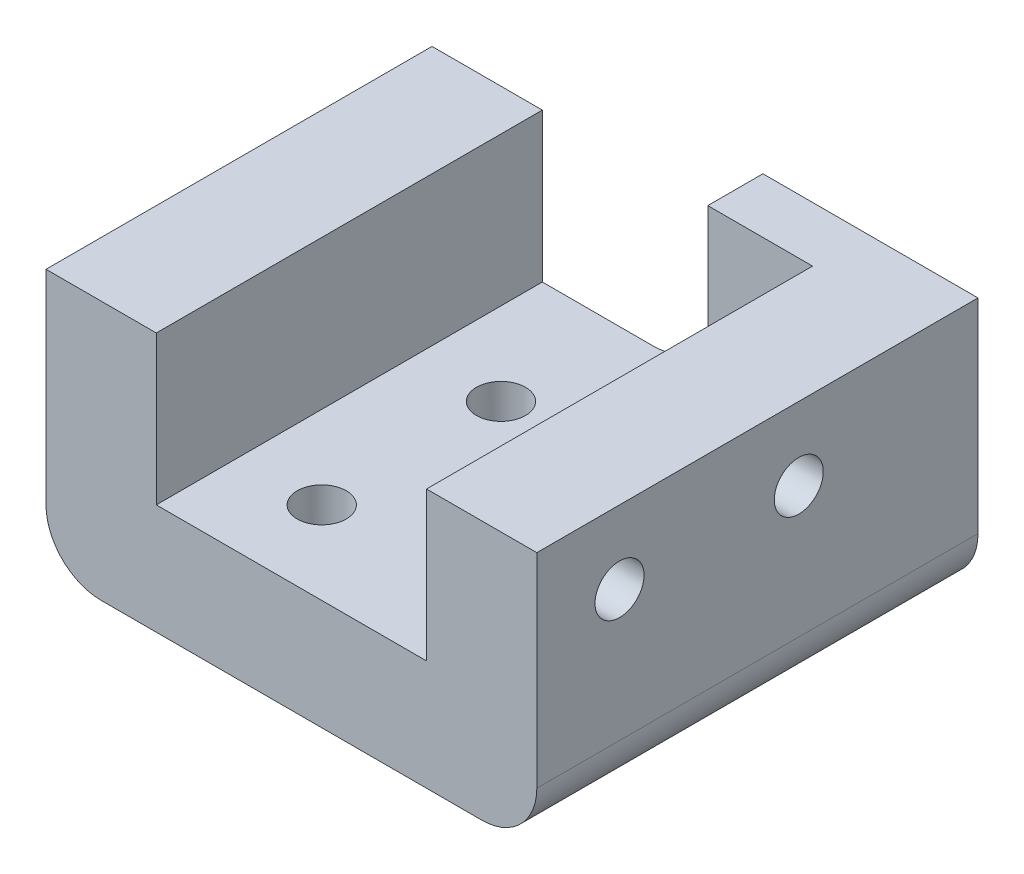
ISO-10303-21;
HEADER;
FILE_DESCRIPTION(('STEP AP214'),'2;1');
FILE_NAME('part.step','',(''),(''),'','','');
FILE_SCHEMA(('AUTOMOTIVE_DESIGN { 1 0 10303 214 1 1 1 1 }'));
ENDSEC;
DATA;
#1=APPLICATION_CONTEXT('core data for automotive mechanical design processes');
#2=APPLICATION_PROTOCOL_DEFINITION('international standard','automotive_design',2000,#1);
#3=PRODUCT_CONTEXT('',#1,'mechanical');
#4=PRODUCT('Part','Part','',(#3));
#5=PRODUCT_RELATED_PRODUCT_CATEGORY('part','',(#4));
#6=PRODUCT_DEFINITION_FORMATION('','',#4);
#7=PRODUCT_DEFINITION_CONTEXT('part definition',#1,'design');
#8=PRODUCT_DEFINITION('design','',#6,#7);
#9=PRODUCT_DEFINITION_SHAPE('','',#8);
#10=(LENGTH_UNIT() NAMED_UNIT(*) SI_UNIT(.MILLI.,.METRE.));
#11=(NAMED_UNIT(*) PLANE_ANGLE_UNIT() SI_UNIT($,.RADIAN.));
#12=(NAMED_UNIT(*) SI_UNIT($,.STERADIAN.) SOLID_ANGLE_UNIT());
#13=UNCERTAINTY_MEASURE_WITH_UNIT(LENGTH_MEASURE(1.E-05),#10,'distance_accuracy_value','');
#14=(GEOMETRIC_REPRESENTATION_CONTEXT(3) GLOBAL_UNCERTAINTY_ASSIGNED_CONTEXT((#13)) GLOBAL_UNIT_ASSIGNED_CONTEXT((#10,
#11,#12)) REPRESENTATION_CONTEXT('',''));
#15=CARTESIAN_POINT('',(0.,0.,0.));
#16=DIRECTION('',(0.,0.,1.));
#17=DIRECTION('',(1.,0.,0.));
#18=AXIS2_PLACEMENT_3D('',#15,#16,#17);
#19=CARTESIAN_POINT('',(2.075,2.,-3.5));
#20=DIRECTION('',(0.,0.,1.));
#21=DIRECTION('',(1.,0.,0.));
#22=AXIS2_PLACEMENT_3D('',#19,#20,#21);
#23=PLANE('',#22);
#24=DIRECTION('',(-1.,0.,0.));
#25=VECTOR('',#24,1.);
#26=CARTESIAN_POINT('',(2.075,0.,-3.5));
#27=LINE('',#26,#25);
#28=CARTESIAN_POINT('',(-0.0750000000000004,0.,-3.5));
#29=VERTEX_POINT('',#28);
#30=CARTESIAN_POINT('',(-3.075,0.,-3.5));
#31=VERTEX_POINT('',#30);
#32=EDGE_CURVE('E154',#29,#31,#27,.T.);
#33=ORIENTED_EDGE('',*,*,#32,.T.);
#34=CARTESIAN_POINT('',(-3.075,1.,-3.5));
#35=DIRECTION('',(0.,0.,1.));
#36=DIRECTION('',(1.,0.,0.));
#37=AXIS2_PLACEMENT_3D('',#34,#35,#36);
#38=CIRCLE('',#37,1.);
#39=CARTESIAN_POINT('',(-4.075,1.,-3.5));
#40=VERTEX_POINT('',#39);
#41=EDGE_CURVE('E11',#31,#40,#38,.F.);
#42=ORIENTED_EDGE('',*,*,#41,.T.);
#43=DIRECTION('',(0.,-1.,0.));
#44=VECTOR('',#43,1.);
#45=CARTESIAN_POINT('',(-4.075,2.,-3.5));
#46=LINE('',#45,#44);
#47=CARTESIAN_POINT('',(-4.075,4.7,-3.5));
#48=VERTEX_POINT('',#47);
#49=EDGE_CURVE('E241',#48,#40,#46,.T.);
#50=ORIENTED_EDGE('',*,*,#49,.F.);
#51=DIRECTION('',(-1.,0.,0.));
#52=VECTOR('',#51,1.);
#53=CARTESIAN_POINT('',(-4.075,4.7,-3.5));
#54=LINE('',#53,#52);
#55=CARTESIAN_POINT('',(-2.075,4.7,-3.5));
#56=VERTEX_POINT('',#55);
#57=EDGE_CURVE('E214',#56,#48,#54,.T.);
#58=ORIENTED_EDGE('',*,*,#57,.F.);
#59=DIRECTION('',(0.,-1.,0.));
#60=VECTOR('',#59,1.);
#61=CARTESIAN_POINT('',(-2.075,4.7,-3.5));
#62=LINE('',#61,#60);
#63=CARTESIAN_POINT('',(-2.075,2.,-3.5));
#64=VERTEX_POINT('',#63);
#65=EDGE_CURVE('E217',#56,#64,#62,.T.);
#66=ORIENTED_EDGE('',*,*,#65,.T.);
#67=DIRECTION('',(-1.,0.,0.));
#68=VECTOR('',#67,1.);
#69=CARTESIAN_POINT('',(-2.075,2.,-3.5));
#70=LINE('',#69,#68);
#71=CARTESIAN_POINT('',(-0.0750000000000013,2.,-3.5));
#72=VERTEX_POINT('',#71);
#73=EDGE_CURVE('E230',#72,#64,#70,.T.);
#74=ORIENTED_EDGE('',*,*,#73,.F.);
#75=DIRECTION('',(0.,1.,0.));
#76=VECTOR('',#75,1.);
#77=CARTESIAN_POINT('',(-0.0750000000000014,0.,-3.5));
#78=LINE('',#77,#76);
#79=EDGE_CURVE('E245',#72,#29,#78,.F.);
#80=ORIENTED_EDGE('',*,*,#79,.T.);
#81=EDGE_LOOP('',(#33,#42,#50,#58,#66,#74,#80));
#82=FACE_BOUND('',#81,.T.);
#83=ADVANCED_FACE('F40',(#82),#23,.F.);
#84=CARTESIAN_POINT('',(0.,2.,0.));
#85=DIRECTION('',(0.,1.,0.));
#86=DIRECTION('',(0.,0.,1.));
#87=AXIS2_PLACEMENT_3D('',#84,#85,#86);
#88=PLANE('',#87);
#89=CARTESIAN_POINT('',(-0.575,2.,2.));
#90=DIRECTION('',(0.,1.,0.));
#91=DIRECTION('',(0.,0.,1.));
#92=AXIS2_PLACEMENT_3D('',#89,#90,#91);
#93=CIRCLE('',#92,0.4445);
#94=CARTESIAN_POINT('',(-0.575,2.,2.4445));
#95=VERTEX_POINT('',#94);
#96=EDGE_CURVE('E172',#95,#95,#93,.T.);
#97=ORIENTED_EDGE('',*,*,#96,.F.);
#98=EDGE_LOOP('',(#97));
#99=FACE_BOUND('',#98,.T.);
#100=CARTESIAN_POINT('',(-0.575,2.,-1.25));
#101=DIRECTION('',(0.,1.,0.));
#102=DIRECTION('',(0.,0.,1.));
#103=AXIS2_PLACEMENT_3D('',#100,#101,#102);
#104=CIRCLE('',#103,0.4445);
#105=CARTESIAN_POINT('',(-0.575,2.,-0.8055));
#106=VERTEX_POINT('',#105);
#107=EDGE_CURVE('E300',#106,#106,#104,.T.);
#108=ORIENTED_EDGE('',*,*,#107,.F.);
#109=EDGE_LOOP('',(#108));
#110=FACE_BOUND('',#109,.T.);
#111=DIRECTION('',(1.,0.,0.));
#112=VECTOR('',#111,1.);
#113=CARTESIAN_POINT('',(-4.075,2.,3.5));
#114=LINE('',#113,#112);
#115=CARTESIAN_POINT('',(-2.075,2.,3.5));
#116=VERTEX_POINT('',#115);
#117=CARTESIAN_POINT('',(2.825,2.,3.5));
#118=VERTEX_POINT('',#117);
#119=EDGE_CURVE('E229',#116,#118,#114,.T.);
#120=ORIENTED_EDGE('',*,*,#119,.T.);
#121=DIRECTION('',(0.,0.,1.));
#122=VECTOR('',#121,1.);
#123=CARTESIAN_POINT('',(2.825,2.,-3.5));
#124=LINE('',#123,#122);
#125=CARTESIAN_POINT('',(2.825,2.,-3.5));
#126=VERTEX_POINT('',#125);
#127=EDGE_CURVE('E196',#126,#118,#124,.T.);
#128=ORIENTED_EDGE('',*,*,#127,.F.);
#129=CARTESIAN_POINT('',(0.924999999999999,2.,-3.5));
#130=VERTEX_POINT('',#129);
#131=EDGE_CURVE('E226',#126,#130,#70,.T.);
#132=ORIENTED_EDGE('',*,*,#131,.T.);
#133=DIRECTION('',(0.,0.,1.));
#134=VECTOR('',#133,1.);
#135=CARTESIAN_POINT('',(0.924999999999999,2.,-4.5));
#136=LINE('',#135,#134);
#137=CARTESIAN_POINT('',(0.924999999999999,2.,-4.5));
#138=VERTEX_POINT('',#137);
#139=EDGE_CURVE('E243',#138,#130,#136,.T.);
#140=ORIENTED_EDGE('',*,*,#139,.F.);
#141=CARTESIAN_POINT('',(-0.0750000000000012,2.,-4.5));
#142=DIRECTION('',(0.,1.,0.));
#143=DIRECTION('',(0.,0.,1.));
#144=AXIS2_PLACEMENT_3D('',#141,#142,#143);
#145=CIRCLE('',#144,1.);
#146=EDGE_CURVE('E158',#138,#72,#145,.F.);
#147=ORIENTED_EDGE('',*,*,#146,.T.);
#148=ORIENTED_EDGE('',*,*,#73,.T.);
#149=DIRECTION('',(0.,0.,-1.));
#150=VECTOR('',#149,1.);
#151=CARTESIAN_POINT('',(-2.075,2.,-3.5));
#152=LINE('',#151,#150);
#153=EDGE_CURVE('E199',#116,#64,#152,.T.);
#154=ORIENTED_EDGE('',*,*,#153,.F.);
#155=EDGE_LOOP('',(#120,#128,#132,#140,#147,#148,#154));
#156=FACE_BOUND('',#155,.T.);
#157=ADVANCED_FACE('F275',(#99,#110,#156),#88,.T.);
#158=CARTESIAN_POINT('',(-4.075,2.,-3.5));
#159=DIRECTION('',(1.,0.,0.));
#160=DIRECTION('',(0.,0.,-1.));
#161=AXIS2_PLACEMENT_3D('',#158,#159,#160);
#162=PLANE('',#161);
#163=ORIENTED_EDGE('',*,*,#49,.T.);
#164=DIRECTION('',(0.,0.,1.));
#165=VECTOR('',#164,1.);
#166=CARTESIAN_POINT('',(-4.075,1.,-3.5));
#167=LINE('',#166,#165);
#168=CARTESIAN_POINT('',(-4.075,1.,3.5));
#169=VERTEX_POINT('',#168);
#170=EDGE_CURVE('E48',#40,#169,#167,.T.);
#171=ORIENTED_EDGE('',*,*,#170,.T.);
#172=DIRECTION('',(0.,-1.,0.));
#173=VECTOR('',#172,1.);
#174=CARTESIAN_POINT('',(-4.075,2.,3.5));
#175=LINE('',#174,#173);
#176=CARTESIAN_POINT('',(-4.075,4.7,3.5));
#177=VERTEX_POINT('',#176);
#178=EDGE_CURVE('E238',#177,#169,#175,.T.);
#179=ORIENTED_EDGE('',*,*,#178,.F.);
#180=DIRECTION('',(0.,0.,1.));
#181=VECTOR('',#180,1.);
#182=CARTESIAN_POINT('',(-4.075,4.7,-3.5));
#183=LINE('',#182,#181);
#184=EDGE_CURVE('E207',#48,#177,#183,.T.);
#185=ORIENTED_EDGE('',*,*,#184,.F.);
#186=EDGE_LOOP('',(#163,#171,#179,#185));
#187=FACE_BOUND('',#186,.T.);
#188=ADVANCED_FACE('F258',(#187),#162,.F.);
#189=CARTESIAN_POINT('',(4.825,2.,3.5));
#190=DIRECTION('',(0.,0.,-1.));
#191=DIRECTION('',(-1.,0.,0.));
#192=AXIS2_PLACEMENT_3D('',#189,#190,#191);
#193=PLANE('',#192);
#194=DIRECTION('',(1.,0.,0.));
#195=VECTOR('',#194,1.);
#196=CARTESIAN_POINT('',(4.825,0.,3.5));
#197=LINE('',#196,#195);
#198=CARTESIAN_POINT('',(-3.075,0.,3.5));
#199=VERTEX_POINT('',#198);
#200=CARTESIAN_POINT('',(3.825,0.,3.5));
#201=VERTEX_POINT('',#200);
#202=EDGE_CURVE('E225',#199,#201,#197,.T.);
#203=ORIENTED_EDGE('',*,*,#202,.T.);
#204=CARTESIAN_POINT('',(3.825,1.,3.5));
#205=DIRECTION('',(0.,0.,-1.));
#206=DIRECTION('',(-1.,0.,0.));
#207=AXIS2_PLACEMENT_3D('',#204,#205,#206);
#208=CIRCLE('',#207,1.);
#209=CARTESIAN_POINT('',(4.825,1.,3.5));
#210=VERTEX_POINT('',#209);
#211=EDGE_CURVE('E256',#201,#210,#208,.F.);
#212=ORIENTED_EDGE('',*,*,#211,.T.);
#213=DIRECTION('',(0.,-1.,0.));
#214=VECTOR('',#213,1.);
#215=CARTESIAN_POINT('',(4.825,2.,3.5));
#216=LINE('',#215,#214);
#217=CARTESIAN_POINT('',(4.825,4.7,3.5));
#218=VERTEX_POINT('',#217);
#219=EDGE_CURVE('E232',#218,#210,#216,.T.);
#220=ORIENTED_EDGE('',*,*,#219,.F.);
#221=DIRECTION('',(1.,0.,0.));
#222=VECTOR('',#221,1.);
#223=CARTESIAN_POINT('',(2.825,4.7,3.5));
#224=LINE('',#223,#222);
#225=CARTESIAN_POINT('',(2.825,4.7,3.5));
#226=VERTEX_POINT('',#225);
#227=EDGE_CURVE('E202',#226,#218,#224,.T.);
#228=ORIENTED_EDGE('',*,*,#227,.F.);
#229=DIRECTION('',(0.,-1.,0.));
#230=VECTOR('',#229,1.);
#231=CARTESIAN_POINT('',(2.825,4.7,3.5));
#232=LINE('',#231,#230);
#233=EDGE_CURVE('E181',#226,#118,#232,.T.);
#234=ORIENTED_EDGE('',*,*,#233,.T.);
#235=ORIENTED_EDGE('',*,*,#119,.F.);
#236=DIRECTION('',(0.,-1.,0.));
#237=VECTOR('',#236,1.);
#238=CARTESIAN_POINT('',(-2.075,4.7,3.5));
#239=LINE('',#238,#237);
#240=CARTESIAN_POINT('',(-2.075,4.7,3.5));
#241=VERTEX_POINT('',#240);
#242=EDGE_CURVE('E222',#241,#116,#239,.T.);
#243=ORIENTED_EDGE('',*,*,#242,.F.);
#244=DIRECTION('',(1.,0.,0.));
#245=VECTOR('',#244,1.);
#246=CARTESIAN_POINT('',(-4.075,4.7,3.5));
#247=LINE('',#246,#245);
#248=EDGE_CURVE('E210',#177,#241,#247,.T.);
#249=ORIENTED_EDGE('',*,*,#248,.F.);
#250=ORIENTED_EDGE('',*,*,#178,.T.);
#251=CARTESIAN_POINT('',(-3.075,1.,3.5));
#252=DIRECTION('',(0.,0.,-1.));
#253=DIRECTION('',(-1.,0.,0.));
#254=AXIS2_PLACEMENT_3D('',#251,#252,#253);
#255=CIRCLE('',#254,1.);
#256=EDGE_CURVE('E61',#169,#199,#255,.F.);
#257=ORIENTED_EDGE('',*,*,#256,.T.);
#258=EDGE_LOOP('',(#203,#212,#220,#228,#234,#235,#243,#249,#250,#257));
#259=FACE_BOUND('',#258,.T.);
#260=ADVANCED_FACE('F262',(#259),#193,.F.);
#261=CARTESIAN_POINT('',(4.825,2.,-3.5));
#262=DIRECTION('',(-1.,0.,0.));
#263=DIRECTION('',(0.,0.,1.));
#264=AXIS2_PLACEMENT_3D('',#261,#262,#263);
#265=PLANE('',#264);
#266=CARTESIAN_POINT('',(4.825,3.375,-1.25));
#267=DIRECTION('',(-1.,0.,0.));
#268=DIRECTION('',(0.,0.,1.));
#269=AXIS2_PLACEMENT_3D('',#266,#267,#268);
#270=CIRCLE('',#269,0.4445);
#271=CARTESIAN_POINT('',(4.825,3.375,-0.8055));
#272=VERTEX_POINT('',#271);
#273=EDGE_CURVE('E178',#272,#272,#270,.T.);
#274=ORIENTED_EDGE('',*,*,#273,.T.);
#275=EDGE_LOOP('',(#274));
#276=FACE_BOUND('',#275,.T.);
#277=CARTESIAN_POINT('',(4.825,3.375,2.));
#278=DIRECTION('',(-1.,0.,0.));
#279=DIRECTION('',(0.,0.,1.));
#280=AXIS2_PLACEMENT_3D('',#277,#278,#279);
#281=CIRCLE('',#280,0.4445);
#282=CARTESIAN_POINT('',(4.825,3.375,2.4445));
#283=VERTEX_POINT('',#282);
#284=EDGE_CURVE('E177',#283,#283,#281,.T.);
#285=ORIENTED_EDGE('',*,*,#284,.T.);
#286=EDGE_LOOP('',(#285));
#287=FACE_BOUND('',#286,.T.);
#288=ORIENTED_EDGE('',*,*,#219,.T.);
#289=DIRECTION('',(0.,0.,-1.));
#290=VECTOR('',#289,1.);
#291=CARTESIAN_POINT('',(4.825,1.,-3.5));
#292=LINE('',#291,#290);
#293=CARTESIAN_POINT('',(4.825,1.,-4.5));
#294=VERTEX_POINT('',#293);
#295=EDGE_CURVE('E157',#210,#294,#292,.T.);
#296=ORIENTED_EDGE('',*,*,#295,.T.);
#297=DIRECTION('',(0.,-1.,0.));
#298=VECTOR('',#297,1.);
#299=CARTESIAN_POINT('',(4.825,4.7,-4.5));
#300=LINE('',#299,#298);
#301=CARTESIAN_POINT('',(4.825,4.7,-4.5));
#302=VERTEX_POINT('',#301);
#303=EDGE_CURVE('E148',#302,#294,#300,.T.);
#304=ORIENTED_EDGE('',*,*,#303,.F.);
#305=DIRECTION('',(0.,0.,-1.));
#306=VECTOR('',#305,1.);
#307=CARTESIAN_POINT('',(4.825,4.7,-3.5));
#308=LINE('',#307,#306);
#309=EDGE_CURVE('E195',#218,#302,#308,.T.);
#310=ORIENTED_EDGE('',*,*,#309,.F.);
#311=EDGE_LOOP('',(#288,#296,#304,#310));
#312=FACE_BOUND('',#311,.T.);
#313=ADVANCED_FACE('F295',(#276,#287,#312),#265,.F.);
#314=CARTESIAN_POINT('',(0.,0.,0.));
#315=DIRECTION('',(0.,1.,0.));
#316=DIRECTION('',(0.,0.,1.));
#317=AXIS2_PLACEMENT_3D('',#314,#315,#316);
#318=PLANE('',#317);
#319=CARTESIAN_POINT('',(-0.575,0.,2.));
#320=DIRECTION('',(0.,-1.,0.));
#321=DIRECTION('',(0.,0.,-1.));
#322=AXIS2_PLACEMENT_3D('',#319,#320,#321);
#323=CIRCLE('',#322,0.4445);
#324=CARTESIAN_POINT('',(-0.575,0.,1.5555));
#325=VERTEX_POINT('',#324);
#326=EDGE_CURVE('E303',#325,#325,#323,.T.);
#327=ORIENTED_EDGE('',*,*,#326,.F.);
#328=EDGE_LOOP('',(#327));
#329=FACE_BOUND('',#328,.T.);
#330=CARTESIAN_POINT('',(-0.575,0.,-1.25));
#331=DIRECTION('',(0.,-1.,0.));
#332=DIRECTION('',(0.,0.,-1.));
#333=AXIS2_PLACEMENT_3D('',#330,#331,#332);
#334=CIRCLE('',#333,0.4445);
#335=CARTESIAN_POINT('',(-0.575,0.,-1.6945));
#336=VERTEX_POINT('',#335);
#337=EDGE_CURVE('E304',#336,#336,#334,.T.);
#338=ORIENTED_EDGE('',*,*,#337,.F.);
#339=EDGE_LOOP('',(#338));
#340=FACE_BOUND('',#339,.T.);
#341=DIRECTION('',(-1.,0.,0.));
#342=VECTOR('',#341,1.);
#343=CARTESIAN_POINT('',(4.825,0.,-4.5));
#344=LINE('',#343,#342);
#345=CARTESIAN_POINT('',(3.825,0.,-4.5));
#346=VERTEX_POINT('',#345);
#347=CARTESIAN_POINT('',(0.924999999999998,0.,-4.5));
#348=VERTEX_POINT('',#347);
#349=EDGE_CURVE('E138',#346,#348,#344,.T.);
#350=ORIENTED_EDGE('',*,*,#349,.F.);
#351=DIRECTION('',(0.,0.,-1.));
#352=VECTOR('',#351,1.);
#353=CARTESIAN_POINT('',(3.825,0.,0.));
#354=LINE('',#353,#352);
#355=EDGE_CURVE('E253',#346,#201,#354,.F.);
#356=ORIENTED_EDGE('',*,*,#355,.T.);
#357=ORIENTED_EDGE('',*,*,#202,.F.);
#358=DIRECTION('',(0.,0.,1.));
#359=VECTOR('',#358,1.);
#360=CARTESIAN_POINT('',(-3.075,0.,0.));
#361=LINE('',#360,#359);
#362=EDGE_CURVE('E251',#199,#31,#361,.F.);
#363=ORIENTED_EDGE('',*,*,#362,.T.);
#364=ORIENTED_EDGE('',*,*,#32,.F.);
#365=CARTESIAN_POINT('',(-0.0750000000000015,0.,-4.5));
#366=DIRECTION('',(0.,1.,0.));
#367=DIRECTION('',(0.,0.,1.));
#368=AXIS2_PLACEMENT_3D('',#365,#366,#367);
#369=CIRCLE('',#368,1.);
#370=EDGE_CURVE('E152',#29,#348,#369,.T.);
#371=ORIENTED_EDGE('',*,*,#370,.T.);
#372=EDGE_LOOP('',(#350,#356,#357,#363,#364,#371));
#373=FACE_BOUND('',#372,.T.);
#374=ADVANCED_FACE('F153',(#329,#340,#373),#318,.F.);
#375=CARTESIAN_POINT('',(-2.075,4.7,-3.5));
#376=DIRECTION('',(-1.,0.,0.));
#377=DIRECTION('',(0.,0.,1.));
#378=AXIS2_PLACEMENT_3D('',#375,#376,#377);
#379=PLANE('',#378);
#380=ORIENTED_EDGE('',*,*,#153,.T.);
#381=ORIENTED_EDGE('',*,*,#65,.F.);
#382=DIRECTION('',(0.,0.,-1.));
#383=VECTOR('',#382,1.);
#384=CARTESIAN_POINT('',(-2.075,4.7,-3.5));
#385=LINE('',#384,#383);
#386=EDGE_CURVE('E212',#241,#56,#385,.T.);
#387=ORIENTED_EDGE('',*,*,#386,.F.);
#388=ORIENTED_EDGE('',*,*,#242,.T.);
#389=EDGE_LOOP('',(#380,#381,#387,#388));
#390=FACE_BOUND('',#389,.T.);
#391=ADVANCED_FACE('F273',(#390),#379,.F.);
#392=CARTESIAN_POINT('',(0.,4.7,0.));
#393=DIRECTION('',(0.,1.,0.));
#394=DIRECTION('',(0.,0.,1.));
#395=AXIS2_PLACEMENT_3D('',#392,#393,#394);
#396=PLANE('',#395);
#397=ORIENTED_EDGE('',*,*,#184,.T.);
#398=ORIENTED_EDGE('',*,*,#248,.T.);
#399=ORIENTED_EDGE('',*,*,#386,.T.);
#400=ORIENTED_EDGE('',*,*,#57,.T.);
#401=EDGE_LOOP('',(#397,#398,#399,#400));
#402=FACE_BOUND('',#401,.T.);
#403=ADVANCED_FACE('F268',(#402),#396,.T.);
#404=CARTESIAN_POINT('',(2.825,4.7,-3.5));
#405=DIRECTION('',(1.,0.,0.));
#406=DIRECTION('',(0.,0.,-1.));
#407=AXIS2_PLACEMENT_3D('',#404,#405,#406);
#408=PLANE('',#407);
#409=CARTESIAN_POINT('',(2.825,3.375,-1.25));
#410=DIRECTION('',(-1.,0.,0.));
#411=DIRECTION('',(0.,0.,1.));
#412=AXIS2_PLACEMENT_3D('',#409,#410,#411);
#413=CIRCLE('',#412,0.4445);
#414=CARTESIAN_POINT('',(2.825,3.375,-0.8055));
#415=VERTEX_POINT('',#414);
#416=EDGE_CURVE('E182',#415,#415,#413,.T.);
#417=ORIENTED_EDGE('',*,*,#416,.F.);
#418=EDGE_LOOP('',(#417));
#419=FACE_BOUND('',#418,.T.);
#420=CARTESIAN_POINT('',(2.825,3.375,2.));
#421=DIRECTION('',(-1.,0.,0.));
#422=DIRECTION('',(0.,0.,1.));
#423=AXIS2_PLACEMENT_3D('',#420,#421,#422);
#424=CIRCLE('',#423,0.4445);
#425=CARTESIAN_POINT('',(2.825,3.375,2.4445));
#426=VERTEX_POINT('',#425);
#427=EDGE_CURVE('E185',#426,#426,#424,.T.);
#428=ORIENTED_EDGE('',*,*,#427,.F.);
#429=EDGE_LOOP('',(#428));
#430=FACE_BOUND('',#429,.T.);
#431=ORIENTED_EDGE('',*,*,#127,.T.);
#432=ORIENTED_EDGE('',*,*,#233,.F.);
#433=DIRECTION('',(0.,0.,1.));
#434=VECTOR('',#433,1.);
#435=CARTESIAN_POINT('',(2.825,4.7,-3.5));
#436=LINE('',#435,#434);
#437=CARTESIAN_POINT('',(2.825,4.7,-3.5));
#438=VERTEX_POINT('',#437);
#439=EDGE_CURVE('E200',#438,#226,#436,.T.);
#440=ORIENTED_EDGE('',*,*,#439,.F.);
#441=DIRECTION('',(0.,-1.,0.));
#442=VECTOR('',#441,1.);
#443=CARTESIAN_POINT('',(2.825,4.7,-3.5));
#444=LINE('',#443,#442);
#445=EDGE_CURVE('E192',#438,#126,#444,.T.);
#446=ORIENTED_EDGE('',*,*,#445,.T.);
#447=EDGE_LOOP('',(#431,#432,#440,#446));
#448=FACE_BOUND('',#447,.T.);
#449=ADVANCED_FACE('F278',(#419,#430,#448),#408,.F.);
#450=CARTESIAN_POINT('',(0.,4.7,0.));
#451=DIRECTION('',(0.,1.,0.));
#452=DIRECTION('',(0.,0.,1.));
#453=AXIS2_PLACEMENT_3D('',#450,#451,#452);
#454=PLANE('',#453);
#455=ORIENTED_EDGE('',*,*,#439,.T.);
#456=ORIENTED_EDGE('',*,*,#227,.T.);
#457=ORIENTED_EDGE('',*,*,#309,.T.);
#458=DIRECTION('',(1.,0.,0.));
#459=VECTOR('',#458,1.);
#460=CARTESIAN_POINT('',(4.825,4.7,-4.5));
#461=LINE('',#460,#459);
#462=CARTESIAN_POINT('',(0.924999999999999,4.7,-4.5));
#463=VERTEX_POINT('',#462);
#464=EDGE_CURVE('E162',#463,#302,#461,.T.);
#465=ORIENTED_EDGE('',*,*,#464,.F.);
#466=DIRECTION('',(0.,0.,1.));
#467=VECTOR('',#466,1.);
#468=CARTESIAN_POINT('',(0.924999999999999,4.7,-4.5));
#469=LINE('',#468,#467);
#470=CARTESIAN_POINT('',(0.924999999999999,4.7,-3.5));
#471=VERTEX_POINT('',#470);
#472=EDGE_CURVE('E165',#463,#471,#469,.T.);
#473=ORIENTED_EDGE('',*,*,#472,.T.);
#474=DIRECTION('',(1.,0.,0.));
#475=VECTOR('',#474,1.);
#476=CARTESIAN_POINT('',(4.825,4.7,-3.5));
#477=LINE('',#476,#475);
#478=EDGE_CURVE('E171',#471,#438,#477,.T.);
#479=ORIENTED_EDGE('',*,*,#478,.T.);
#480=EDGE_LOOP('',(#455,#456,#457,#465,#473,#479));
#481=FACE_BOUND('',#480,.T.);
#482=ADVANCED_FACE('F291',(#481),#454,.T.);
#483=CARTESIAN_POINT('',(4.825,3.375,2.));
#484=DIRECTION('',(-1.,0.,0.));
#485=DIRECTION('',(0.,0.,1.));
#486=AXIS2_PLACEMENT_3D('',#483,#484,#485);
#487=CYLINDRICAL_SURFACE('',#486,0.4445);
#488=ORIENTED_EDGE('',*,*,#284,.F.);
#489=EDGE_LOOP('',(#488));
#490=FACE_BOUND('',#489,.T.);
#491=ORIENTED_EDGE('',*,*,#427,.T.);
#492=EDGE_LOOP('',(#491));
#493=FACE_BOUND('',#492,.T.);
#494=ADVANCED_FACE('F406',(#490,#493),#487,.F.);
#495=CARTESIAN_POINT('',(4.825,3.375,-1.25));
#496=DIRECTION('',(-1.,0.,0.));
#497=DIRECTION('',(0.,0.,1.));
#498=AXIS2_PLACEMENT_3D('',#495,#496,#497);
#499=CYLINDRICAL_SURFACE('',#498,0.4445);
#500=ORIENTED_EDGE('',*,*,#273,.F.);
#501=EDGE_LOOP('',(#500));
#502=FACE_BOUND('',#501,.T.);
#503=ORIENTED_EDGE('',*,*,#416,.T.);
#504=EDGE_LOOP('',(#503));
#505=FACE_BOUND('',#504,.T.);
#506=ADVANCED_FACE('F398',(#502,#505),#499,.F.);
#507=CARTESIAN_POINT('',(0.924999999999999,4.7,-4.5));
#508=DIRECTION('',(1.,0.,0.));
#509=DIRECTION('',(0.,1.,0.));
#510=AXIS2_PLACEMENT_3D('',#507,#508,#509);
#511=PLANE('',#510);
#512=DIRECTION('',(0.,1.,0.));
#513=VECTOR('',#512,1.);
#514=CARTESIAN_POINT('',(0.924999999999999,4.7,-4.5));
#515=LINE('',#514,#513);
#516=EDGE_CURVE('E147',#138,#463,#515,.T.);
#517=ORIENTED_EDGE('',*,*,#516,.F.);
#518=ORIENTED_EDGE('',*,*,#139,.T.);
#519=DIRECTION('',(0.,1.,0.));
#520=VECTOR('',#519,1.);
#521=CARTESIAN_POINT('',(0.924999999999999,4.7,-3.5));
#522=LINE('',#521,#520);
#523=EDGE_CURVE('E169',#130,#471,#522,.T.);
#524=ORIENTED_EDGE('',*,*,#523,.T.);
#525=ORIENTED_EDGE('',*,*,#472,.F.);
#526=EDGE_LOOP('',(#517,#518,#524,#525));
#527=FACE_BOUND('',#526,.T.);
#528=ADVANCED_FACE('F288',(#527),#511,.F.);
#529=CARTESIAN_POINT('',(0.,0.,-4.5));
#530=DIRECTION('',(0.,0.,-1.));
#531=DIRECTION('',(-1.,0.,0.));
#532=AXIS2_PLACEMENT_3D('',#529,#530,#531);
#533=PLANE('',#532);
#534=ORIENTED_EDGE('',*,*,#303,.T.);
#535=CARTESIAN_POINT('',(3.825,1.,-4.5));
#536=DIRECTION('',(0.,0.,-1.));
#537=DIRECTION('',(-1.,0.,0.));
#538=AXIS2_PLACEMENT_3D('',#535,#536,#537);
#539=CIRCLE('',#538,1.);
#540=EDGE_CURVE('E144',#294,#346,#539,.T.);
#541=ORIENTED_EDGE('',*,*,#540,.T.);
#542=ORIENTED_EDGE('',*,*,#349,.T.);
#543=EDGE_CURVE('E143',#348,#138,#515,.T.);
#544=ORIENTED_EDGE('',*,*,#543,.T.);
#545=ORIENTED_EDGE('',*,*,#516,.T.);
#546=ORIENTED_EDGE('',*,*,#464,.T.);
#547=EDGE_LOOP('',(#534,#541,#542,#544,#545,#546));
#548=FACE_BOUND('',#547,.T.);
#549=ADVANCED_FACE('F141',(#548),#533,.T.);
#550=CARTESIAN_POINT('',(0.,0.,-3.5));
#551=DIRECTION('',(0.,0.,-1.));
#552=DIRECTION('',(-1.,0.,0.));
#553=AXIS2_PLACEMENT_3D('',#550,#551,#552);
#554=PLANE('',#553);
#555=ORIENTED_EDGE('',*,*,#131,.F.);
#556=ORIENTED_EDGE('',*,*,#445,.F.);
#557=ORIENTED_EDGE('',*,*,#478,.F.);
#558=ORIENTED_EDGE('',*,*,#523,.F.);
#559=EDGE_LOOP('',(#555,#556,#557,#558));
#560=FACE_BOUND('',#559,.T.);
#561=ADVANCED_FACE('F285',(#560),#554,.F.);
#562=CARTESIAN_POINT('',(-0.0750000000000008,4.7,-4.5));
#563=DIRECTION('',(0.,-1.,0.));
#564=DIRECTION('',(1.,0.,0.));
#565=AXIS2_PLACEMENT_3D('',#562,#563,#564);
#566=CYLINDRICAL_SURFACE('',#565,1.);
#567=ORIENTED_EDGE('',*,*,#370,.F.);
#568=ORIENTED_EDGE('',*,*,#79,.F.);
#569=ORIENTED_EDGE('',*,*,#146,.F.);
#570=ORIENTED_EDGE('',*,*,#543,.F.);
#571=EDGE_LOOP('',(#567,#568,#569,#570));
#572=FACE_BOUND('',#571,.T.);
#573=ADVANCED_FACE('F160',(#572),#566,.F.);
#574=CARTESIAN_POINT('',(-0.575,4.7,-1.25));
#575=DIRECTION('',(0.,-1.,0.));
#576=DIRECTION('',(0.,0.,-1.));
#577=AXIS2_PLACEMENT_3D('',#574,#575,#576);
#578=CYLINDRICAL_SURFACE('',#577,0.4445);
#579=ORIENTED_EDGE('',*,*,#107,.T.);
#580=EDGE_LOOP('',(#579));
#581=FACE_BOUND('',#580,.T.);
#582=ORIENTED_EDGE('',*,*,#337,.T.);
#583=EDGE_LOOP('',(#582));
#584=FACE_BOUND('',#583,.T.);
#585=ADVANCED_FACE('F317',(#581,#584),#578,.F.);
#586=CARTESIAN_POINT('',(-0.575,4.7,2.));
#587=DIRECTION('',(0.,-1.,0.));
#588=DIRECTION('',(0.,0.,-1.));
#589=AXIS2_PLACEMENT_3D('',#586,#587,#588);
#590=CYLINDRICAL_SURFACE('',#589,0.4445);
#591=ORIENTED_EDGE('',*,*,#96,.T.);
#592=EDGE_LOOP('',(#591));
#593=FACE_BOUND('',#592,.T.);
#594=ORIENTED_EDGE('',*,*,#326,.T.);
#595=EDGE_LOOP('',(#594));
#596=FACE_BOUND('',#595,.T.);
#597=ADVANCED_FACE('F310',(#593,#596),#590,.F.);
#598=CARTESIAN_POINT('',(3.825,1.,-3.5));
#599=DIRECTION('',(0.,0.,-1.));
#600=DIRECTION('',(-1.,0.,0.));
#601=AXIS2_PLACEMENT_3D('',#598,#599,#600);
#602=CYLINDRICAL_SURFACE('',#601,1.);
#603=ORIENTED_EDGE('',*,*,#211,.F.);
#604=ORIENTED_EDGE('',*,*,#355,.F.);
#605=ORIENTED_EDGE('',*,*,#540,.F.);
#606=ORIENTED_EDGE('',*,*,#295,.F.);
#607=EDGE_LOOP('',(#603,#604,#605,#606));
#608=FACE_BOUND('',#607,.T.);
#609=ADVANCED_FACE('F325',(#608),#602,.T.);
#610=CARTESIAN_POINT('',(-3.075,1.,-3.5));
#611=DIRECTION('',(0.,0.,1.));
#612=DIRECTION('',(1.,0.,0.));
#613=AXIS2_PLACEMENT_3D('',#610,#611,#612);
#614=CYLINDRICAL_SURFACE('',#613,1.);
#615=ORIENTED_EDGE('',*,*,#41,.F.);
#616=ORIENTED_EDGE('',*,*,#362,.F.);
#617=ORIENTED_EDGE('',*,*,#256,.F.);
#618=ORIENTED_EDGE('',*,*,#170,.F.);
#619=EDGE_LOOP('',(#615,#616,#617,#618));
#620=FACE_BOUND('',#619,.T.);
#621=ADVANCED_FACE('F42',(#620),#614,.T.);
#622=CLOSED_SHELL('',(#83,#157,#188,#260,#313,#374,#391,#403,#449,#482,#494,#506,#528,#549,#561,
#573,#585,#597,#609,#621));
#623=MANIFOLD_SOLID_BREP('B2',#622);
#624=ADVANCED_BREP_SHAPE_REPRESENTATION('',(#18,#623),#14);
#625=SHAPE_DEFINITION_REPRESENTATION(#9,#624);
ENDSEC;
END-ISO-10303-21;
